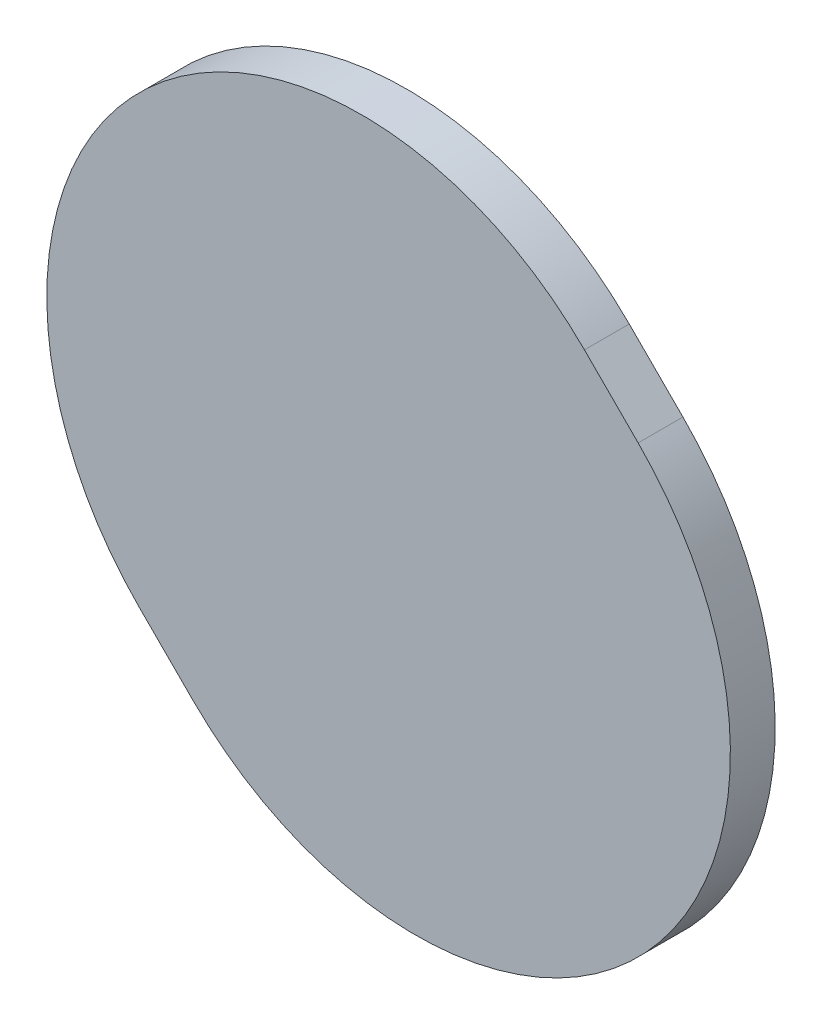
ISO-10303-21;
HEADER;
FILE_DESCRIPTION(('STEP AP214'),'2;1');
FILE_NAME('part.step','',(''),(''),'','','');
FILE_SCHEMA(('AUTOMOTIVE_DESIGN { 1 0 10303 214 1 1 1 1 }'));
ENDSEC;
DATA;
#1=APPLICATION_CONTEXT('core data for automotive mechanical design processes');
#2=APPLICATION_PROTOCOL_DEFINITION('international standard','automotive_design',2000,#1);
#3=PRODUCT_CONTEXT('',#1,'mechanical');
#4=PRODUCT('Part','Part','',(#3));
#5=PRODUCT_RELATED_PRODUCT_CATEGORY('part','',(#4));
#6=PRODUCT_DEFINITION_FORMATION('','',#4);
#7=PRODUCT_DEFINITION_CONTEXT('part definition',#1,'design');
#8=PRODUCT_DEFINITION('design','',#6,#7);
#9=PRODUCT_DEFINITION_SHAPE('','',#8);
#10=(LENGTH_UNIT() NAMED_UNIT(*) SI_UNIT(.MILLI.,.METRE.));
#11=(NAMED_UNIT(*) PLANE_ANGLE_UNIT() SI_UNIT($,.RADIAN.));
#12=(NAMED_UNIT(*) SI_UNIT($,.STERADIAN.) SOLID_ANGLE_UNIT());
#13=UNCERTAINTY_MEASURE_WITH_UNIT(LENGTH_MEASURE(1.E-05),#10,'distance_accuracy_value','');
#14=(GEOMETRIC_REPRESENTATION_CONTEXT(3) GLOBAL_UNCERTAINTY_ASSIGNED_CONTEXT((#13)) GLOBAL_UNIT_ASSIGNED_CONTEXT((#10,
#11,#12)) REPRESENTATION_CONTEXT('',''));
#15=CARTESIAN_POINT('',(0.,0.,0.));
#16=DIRECTION('',(0.,0.,1.));
#17=DIRECTION('',(1.,0.,0.));
#18=AXIS2_PLACEMENT_3D('',#15,#16,#17);
#19=CARTESIAN_POINT('',(94.18061682,85.36224482,0.));
#20=DIRECTION('',(0.707106781186665,0.70710678118643,0.));
#21=DIRECTION('',(0.70710678118643,-0.707106781186665,0.));
#22=AXIS2_PLACEMENT_3D('',#19,#20,#21);
#23=PLANE('',#22);
#24=DIRECTION('',(0.70710678118643,-0.707106781186665,0.));
#25=VECTOR('',#24,1.);
#26=CARTESIAN_POINT('',(94.18061682,85.36224482,0.03556));
#27=LINE('',#26,#25);
#28=CARTESIAN_POINT('',(94.18061682,85.36224482,0.03556));
#29=VERTEX_POINT('',#28);
#30=CARTESIAN_POINT('',(94.22323802,85.31962362,0.03556));
#31=VERTEX_POINT('',#30);
#32=EDGE_CURVE('E11',#29,#31,#27,.T.);
#33=ORIENTED_EDGE('',*,*,#32,.F.);
#34=DIRECTION('',(0.,0.,1.));
#35=VECTOR('',#34,1.);
#36=CARTESIAN_POINT('',(94.18061682,85.36224482,0.));
#37=LINE('',#36,#35);
#38=CARTESIAN_POINT('',(94.18061682,85.36224482,0.));
#39=VERTEX_POINT('',#38);
#40=EDGE_CURVE('E24',#39,#29,#37,.T.);
#41=ORIENTED_EDGE('',*,*,#40,.F.);
#42=DIRECTION('',(0.70710678118643,-0.707106781186665,0.));
#43=VECTOR('',#42,1.);
#44=CARTESIAN_POINT('',(94.18061682,85.36224482,0.));
#45=LINE('',#44,#43);
#46=CARTESIAN_POINT('',(94.22323802,85.31962362,0.));
#47=VERTEX_POINT('',#46);
#48=EDGE_CURVE('E75',#39,#47,#45,.T.);
#49=ORIENTED_EDGE('',*,*,#48,.T.);
#50=DIRECTION('',(0.,0.,1.));
#51=VECTOR('',#50,1.);
#52=CARTESIAN_POINT('',(94.22323802,85.31962362,0.));
#53=LINE('',#52,#51);
#54=EDGE_CURVE('E37',#47,#31,#53,.T.);
#55=ORIENTED_EDGE('',*,*,#54,.T.);
#56=EDGE_LOOP('',(#33,#41,#49,#55));
#57=FACE_BOUND('',#56,.T.);
#58=ADVANCED_FACE('F17',(#57),#23,.F.);
#59=CARTESIAN_POINT('',(94.4000144,85.4964,0.));
#60=DIRECTION('',(0.,0.,-1.));
#61=DIRECTION('',(-0.707106781186548,-0.707106781186548,0.));
#62=AXIS2_PLACEMENT_3D('',#59,#60,#61);
#63=CYLINDRICAL_SURFACE('',#62,0.249999554103223);
#64=CARTESIAN_POINT('',(94.4000144,85.4964,0.03556));
#65=DIRECTION('',(0.,0.,1.));
#66=DIRECTION('',(-0.707106781186548,-0.707106781186548,0.));
#67=AXIS2_PLACEMENT_3D('',#64,#65,#66);
#68=CIRCLE('',#67,0.249999554103223);
#69=CARTESIAN_POINT('',(94.57679078,85.67317638,0.03556));
#70=VERTEX_POINT('',#69);
#71=EDGE_CURVE('E83',#31,#70,#68,.T.);
#72=ORIENTED_EDGE('',*,*,#71,.F.);
#73=ORIENTED_EDGE('',*,*,#54,.F.);
#74=CARTESIAN_POINT('',(94.4000144,85.4964,0.));
#75=DIRECTION('',(0.,0.,1.));
#76=DIRECTION('',(-0.707106781186548,-0.707106781186548,0.));
#77=AXIS2_PLACEMENT_3D('',#74,#75,#76);
#78=CIRCLE('',#77,0.249999554103223);
#79=CARTESIAN_POINT('',(94.57679078,85.67317638,0.));
#80=VERTEX_POINT('',#79);
#81=EDGE_CURVE('E81',#47,#80,#78,.T.);
#82=ORIENTED_EDGE('',*,*,#81,.T.);
#83=DIRECTION('',(0.,0.,1.));
#84=VECTOR('',#83,1.);
#85=CARTESIAN_POINT('',(94.57679078,85.67317638,0.));
#86=LINE('',#85,#84);
#87=EDGE_CURVE('E67',#80,#70,#86,.T.);
#88=ORIENTED_EDGE('',*,*,#87,.T.);
#89=EDGE_LOOP('',(#72,#73,#82,#88));
#90=FACE_BOUND('',#89,.T.);
#91=ADVANCED_FACE('F89',(#90),#63,.T.);
#92=CARTESIAN_POINT('',(94.57679078,85.67317638,0.));
#93=DIRECTION('',(-0.707106781186548,-0.707106781186548,0.));
#94=DIRECTION('',(-0.707106781186548,0.707106781186548,0.));
#95=AXIS2_PLACEMENT_3D('',#92,#93,#94);
#96=PLANE('',#95);
#97=DIRECTION('',(-0.707106781186548,0.707106781186548,0.));
#98=VECTOR('',#97,1.);
#99=CARTESIAN_POINT('',(94.57679078,85.67317638,0.03556));
#100=LINE('',#99,#98);
#101=CARTESIAN_POINT('',(94.53416958,85.71579758,0.03556));
#102=VERTEX_POINT('',#101);
#103=EDGE_CURVE('E71',#70,#102,#100,.T.);
#104=ORIENTED_EDGE('',*,*,#103,.F.);
#105=ORIENTED_EDGE('',*,*,#87,.F.);
#106=DIRECTION('',(-0.707106781186548,0.707106781186548,0.));
#107=VECTOR('',#106,1.);
#108=CARTESIAN_POINT('',(94.57679078,85.67317638,0.));
#109=LINE('',#108,#107);
#110=CARTESIAN_POINT('',(94.53416958,85.71579758,0.));
#111=VERTEX_POINT('',#110);
#112=EDGE_CURVE('E63',#80,#111,#109,.T.);
#113=ORIENTED_EDGE('',*,*,#112,.T.);
#114=DIRECTION('',(0.,0.,1.));
#115=VECTOR('',#114,1.);
#116=CARTESIAN_POINT('',(94.53416958,85.71579758,0.));
#117=LINE('',#116,#115);
#118=EDGE_CURVE('E53',#111,#102,#117,.T.);
#119=ORIENTED_EDGE('',*,*,#118,.T.);
#120=EDGE_LOOP('',(#104,#105,#113,#119));
#121=FACE_BOUND('',#120,.T.);
#122=ADVANCED_FACE('F66',(#121),#96,.F.);
#123=CARTESIAN_POINT('',(94.3573932,85.5390212,0.));
#124=DIRECTION('',(0.,0.,-1.));
#125=DIRECTION('',(0.707106781186576,0.707106781186519,0.));
#126=AXIS2_PLACEMENT_3D('',#123,#124,#125);
#127=CYLINDRICAL_SURFACE('',#126,0.249999554103216);
#128=CARTESIAN_POINT('',(94.3573932,85.5390212,0.03556));
#129=DIRECTION('',(0.,0.,1.));
#130=DIRECTION('',(0.707106781186576,0.707106781186519,0.));
#131=AXIS2_PLACEMENT_3D('',#128,#129,#130);
#132=CIRCLE('',#131,0.249999554103216);
#133=EDGE_CURVE('E59',#102,#29,#132,.T.);
#134=ORIENTED_EDGE('',*,*,#133,.F.);
#135=ORIENTED_EDGE('',*,*,#118,.F.);
#136=CARTESIAN_POINT('',(94.3573932,85.5390212,0.));
#137=DIRECTION('',(0.,0.,1.));
#138=DIRECTION('',(0.707106781186576,0.707106781186519,0.));
#139=AXIS2_PLACEMENT_3D('',#136,#137,#138);
#140=CIRCLE('',#139,0.249999554103216);
#141=EDGE_CURVE('E57',#111,#39,#140,.T.);
#142=ORIENTED_EDGE('',*,*,#141,.T.);
#143=ORIENTED_EDGE('',*,*,#40,.T.);
#144=EDGE_LOOP('',(#134,#135,#142,#143));
#145=FACE_BOUND('',#144,.T.);
#146=ADVANCED_FACE('F55',(#145),#127,.T.);
#147=CARTESIAN_POINT('',(94.18061682,85.36224482,0.));
#148=DIRECTION('',(0.,0.,-1.));
#149=DIRECTION('',(-1.,0.,0.));
#150=AXIS2_PLACEMENT_3D('',#147,#148,#149);
#151=PLANE('',#150);
#152=ORIENTED_EDGE('',*,*,#141,.F.);
#153=ORIENTED_EDGE('',*,*,#112,.F.);
#154=ORIENTED_EDGE('',*,*,#81,.F.);
#155=ORIENTED_EDGE('',*,*,#48,.F.);
#156=EDGE_LOOP('',(#152,#153,#154,#155));
#157=FACE_BOUND('',#156,.T.);
#158=ADVANCED_FACE('F74',(#157),#151,.T.);
#159=CARTESIAN_POINT('',(94.18061682,85.36224482,0.03556));
#160=DIRECTION('',(0.,0.,-1.));
#161=DIRECTION('',(-1.,0.,0.));
#162=AXIS2_PLACEMENT_3D('',#159,#160,#161);
#163=PLANE('',#162);
#164=ORIENTED_EDGE('',*,*,#32,.T.);
#165=ORIENTED_EDGE('',*,*,#71,.T.);
#166=ORIENTED_EDGE('',*,*,#103,.T.);
#167=ORIENTED_EDGE('',*,*,#133,.T.);
#168=EDGE_LOOP('',(#164,#165,#166,#167));
#169=FACE_BOUND('',#168,.T.);
#170=ADVANCED_FACE('F91',(#169),#163,.F.);
#171=CLOSED_SHELL('',(#58,#91,#122,#146,#158,#170));
#172=MANIFOLD_SOLID_BREP('B1',#171);
#173=ADVANCED_BREP_SHAPE_REPRESENTATION('',(#18,#172),#14);
#174=SHAPE_DEFINITION_REPRESENTATION(#9,#173);
ENDSEC;
END-ISO-10303-21;
